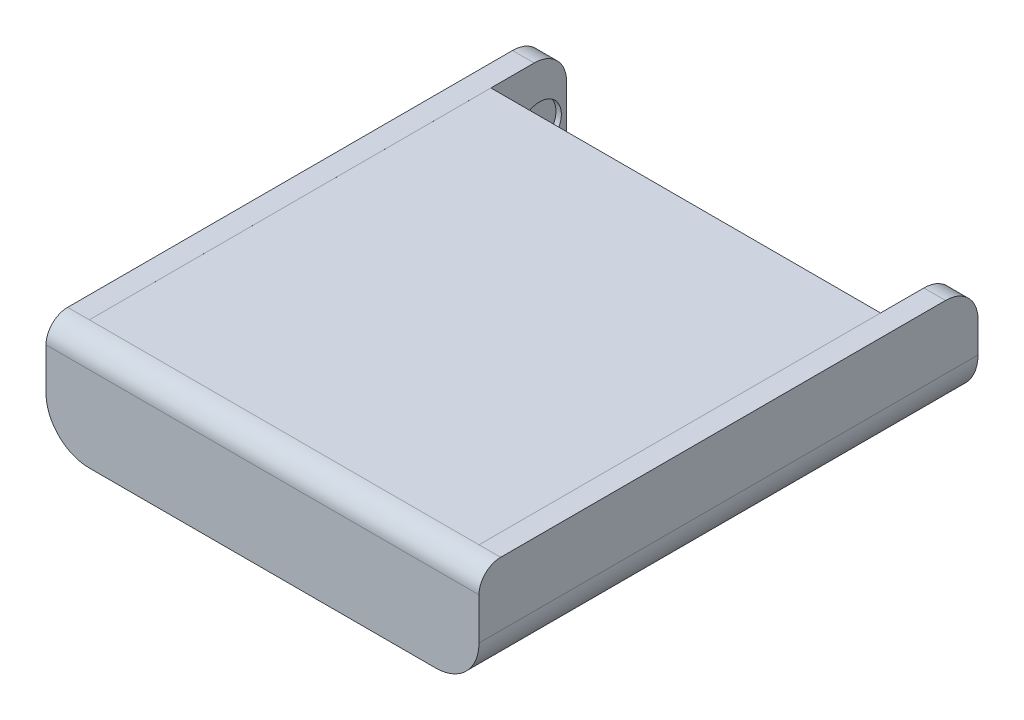
ISO-10303-21;
HEADER;
FILE_DESCRIPTION(('STEP AP214'),'2;1');
FILE_NAME('part.step','',(''),(''),'','','');
FILE_SCHEMA(('AUTOMOTIVE_DESIGN { 1 0 10303 214 1 1 1 1 }'));
ENDSEC;
DATA;
#1=APPLICATION_CONTEXT('core data for automotive mechanical design processes');
#2=APPLICATION_PROTOCOL_DEFINITION('international standard','automotive_design',2000,#1);
#3=PRODUCT_CONTEXT('',#1,'mechanical');
#4=PRODUCT('Part','Part','',(#3));
#5=PRODUCT_RELATED_PRODUCT_CATEGORY('part','',(#4));
#6=PRODUCT_DEFINITION_FORMATION('','',#4);
#7=PRODUCT_DEFINITION_CONTEXT('part definition',#1,'design');
#8=PRODUCT_DEFINITION('design','',#6,#7);
#9=PRODUCT_DEFINITION_SHAPE('','',#8);
#10=(LENGTH_UNIT() NAMED_UNIT(*) SI_UNIT(.MILLI.,.METRE.));
#11=(NAMED_UNIT(*) PLANE_ANGLE_UNIT() SI_UNIT($,.RADIAN.));
#12=(NAMED_UNIT(*) SI_UNIT($,.STERADIAN.) SOLID_ANGLE_UNIT());
#13=UNCERTAINTY_MEASURE_WITH_UNIT(LENGTH_MEASURE(1.E-05),#10,'distance_accuracy_value','');
#14=(GEOMETRIC_REPRESENTATION_CONTEXT(3) GLOBAL_UNCERTAINTY_ASSIGNED_CONTEXT((#13)) GLOBAL_UNIT_ASSIGNED_CONTEXT((#10,
#11,#12)) REPRESENTATION_CONTEXT('',''));
#15=CARTESIAN_POINT('',(0.,0.,0.));
#16=DIRECTION('',(0.,0.,1.));
#17=DIRECTION('',(1.,0.,0.));
#18=AXIS2_PLACEMENT_3D('',#15,#16,#17);
#19=CARTESIAN_POINT('',(139.080001475215,57.170001385808,-2.5));
#20=DIRECTION('',(0.,0.,1.));
#21=DIRECTION('',(1.,0.,0.));
#22=AXIS2_PLACEMENT_3D('',#19,#20,#21);
#23=PLANE('',#22);
#24=DIRECTION('',(1.,0.,0.));
#25=VECTOR('',#24,1.);
#26=CARTESIAN_POINT('',(129.080001475215,58.5303815832172,-2.5));
#27=LINE('',#26,#25);
#28=CARTESIAN_POINT('',(119.080001475215,58.5303815832172,-2.5));
#29=VERTEX_POINT('',#28);
#30=CARTESIAN_POINT('',(159.080001475215,58.5303815832172,-2.5));
#31=VERTEX_POINT('',#30);
#32=EDGE_CURVE('P0_E279',#29,#31,#27,.T.);
#33=ORIENTED_EDGE('',*,*,#32,.F.);
#34=DIRECTION('',(0.,1.,0.));
#35=VECTOR('',#34,1.);
#36=CARTESIAN_POINT('',(119.080001475215,55.920001385808,-2.5));
#37=LINE('',#36,#35);
#38=CARTESIAN_POINT('',(119.080001475215,54.670001385808,-2.5));
#39=VERTEX_POINT('',#38);
#40=EDGE_CURVE('P0_E266',#39,#29,#37,.T.);
#41=ORIENTED_EDGE('',*,*,#40,.F.);
#42=CARTESIAN_POINT('',(123.080001475215,54.670001385808,-2.5));
#43=DIRECTION('',(0.,0.,-1.));
#44=DIRECTION('',(-1.,0.,0.));
#45=AXIS2_PLACEMENT_3D('',#42,#43,#44);
#46=CIRCLE('',#45,4.);
#47=CARTESIAN_POINT('',(123.080001475215,50.670001385808,-2.5));
#48=VERTEX_POINT('',#47);
#49=EDGE_CURVE('P0_E28',#48,#39,#46,.T.);
#50=ORIENTED_EDGE('',*,*,#49,.F.);
#51=DIRECTION('',(-1.,0.,0.));
#52=VECTOR('',#51,1.);
#53=CARTESIAN_POINT('',(147.080001475215,50.670001385808,-2.5));
#54=LINE('',#53,#52);
#55=CARTESIAN_POINT('',(155.080001475215,50.670001385808,-2.5));
#56=VERTEX_POINT('',#55);
#57=EDGE_CURVE('P0_E11',#56,#48,#54,.T.);
#58=ORIENTED_EDGE('',*,*,#57,.F.);
#59=CARTESIAN_POINT('',(155.080001475215,54.670001385808,-2.5));
#60=DIRECTION('',(0.,0.,-1.));
#61=DIRECTION('',(0.,-1.,0.));
#62=AXIS2_PLACEMENT_3D('',#59,#60,#61);
#63=CIRCLE('',#62,4.);
#64=CARTESIAN_POINT('',(159.080001475215,54.670001385808,-2.5));
#65=VERTEX_POINT('',#64);
#66=EDGE_CURVE('P0_E204',#65,#56,#63,.T.);
#67=ORIENTED_EDGE('',*,*,#66,.F.);
#68=DIRECTION('',(0.,-1.,0.));
#69=VECTOR('',#68,1.);
#70=CARTESIAN_POINT('',(159.080001475215,59.1001914845126,-2.5));
#71=LINE('',#70,#69);
#72=EDGE_CURVE('P0_E216',#31,#65,#71,.T.);
#73=ORIENTED_EDGE('',*,*,#72,.F.);
#74=EDGE_LOOP('',(#33,#41,#50,#58,#67,#73));
#75=FACE_BOUND('',#74,.T.);
#76=ADVANCED_FACE('P0_F17',(#75),#23,.T.);
#77=CARTESIAN_POINT('',(139.080001475215,57.170001385808,-48.6));
#78=DIRECTION('',(0.,0.,1.));
#79=DIRECTION('',(1.,0.,0.));
#80=AXIS2_PLACEMENT_3D('',#77,#78,#79);
#81=PLANE('',#80);
#82=DIRECTION('',(-1.,0.,0.));
#83=VECTOR('',#82,1.);
#84=CARTESIAN_POINT('',(129.080001475215,57.5303815832172,-48.6));
#85=LINE('',#84,#83);
#86=CARTESIAN_POINT('',(159.080001475215,57.5303815832172,-48.6));
#87=VERTEX_POINT('',#86);
#88=CARTESIAN_POINT('',(157.080001475215,57.5303815832172,-48.6));
#89=VERTEX_POINT('',#88);
#90=EDGE_CURVE('P0_E283',#87,#89,#85,.T.);
#91=ORIENTED_EDGE('',*,*,#90,.F.);
#92=DIRECTION('',(0.,-1.,0.));
#93=VECTOR('',#92,1.);
#94=CARTESIAN_POINT('',(159.080001475215,61.670001385808,-48.6));
#95=LINE('',#94,#93);
#96=CARTESIAN_POINT('',(159.080001475215,54.670001385808,-48.6));
#97=VERTEX_POINT('',#96);
#98=EDGE_CURVE('P0_E230',#87,#97,#95,.T.);
#99=ORIENTED_EDGE('',*,*,#98,.T.);
#100=CARTESIAN_POINT('',(155.080001475215,54.670001385808,-48.6));
#101=DIRECTION('',(0.,0.,-1.));
#102=DIRECTION('',(0.,-1.,0.));
#103=AXIS2_PLACEMENT_3D('',#100,#101,#102);
#104=CIRCLE('',#103,4.);
#105=CARTESIAN_POINT('',(157.080001475215,51.2058997706702,-48.6));
#106=VERTEX_POINT('',#105);
#107=EDGE_CURVE('P0_E196',#97,#106,#104,.T.);
#108=ORIENTED_EDGE('',*,*,#107,.T.);
#109=DIRECTION('',(0.,1.,0.));
#110=VECTOR('',#109,1.);
#111=CARTESIAN_POINT('',(157.080001475215,55.0908431352626,-48.6));
#112=LINE('',#111,#110);
#113=EDGE_CURVE('P0_E348',#106,#89,#112,.T.);
#114=ORIENTED_EDGE('',*,*,#113,.T.);
#115=EDGE_LOOP('',(#91,#99,#108,#114));
#116=FACE_BOUND('',#115,.T.);
#117=ADVANCED_FACE('P0_F443',(#116),#81,.F.);
#118=CARTESIAN_POINT('',(155.080001475215,50.670001385808,-2.));
#119=DIRECTION('',(0.,-1.,0.));
#120=DIRECTION('',(-1.,0.,0.));
#121=AXIS2_PLACEMENT_3D('',#118,#119,#120);
#122=PLANE('',#121);
#123=CARTESIAN_POINT('',(139.080001475215,50.670001385808,-21.16));
#124=DIRECTION('',(0.,1.,0.));
#125=DIRECTION('',(1.,0.,0.));
#126=AXIS2_PLACEMENT_3D('',#123,#124,#125);
#127=CIRCLE('',#126,4.);
#128=CARTESIAN_POINT('',(135.080001475215,50.670001385808,-21.16));
#129=VERTEX_POINT('',#128);
#130=EDGE_CURVE('P0_E237',#129,#129,#127,.T.);
#131=ORIENTED_EDGE('',*,*,#130,.T.);
#132=EDGE_LOOP('',(#131));
#133=FACE_BOUND('',#132,.T.);
#134=DIRECTION('',(1.,0.,0.));
#135=VECTOR('',#134,1.);
#136=CARTESIAN_POINT('',(147.080001475215,50.670001385808,-41.6));
#137=LINE('',#136,#135);
#138=CARTESIAN_POINT('',(123.080001475215,50.670001385808,-41.6));
#139=VERTEX_POINT('',#138);
#140=CARTESIAN_POINT('',(155.080001475215,50.670001385808,-41.6));
#141=VERTEX_POINT('',#140);
#142=EDGE_CURVE('P0_E308',#139,#141,#137,.T.);
#143=ORIENTED_EDGE('',*,*,#142,.T.);
#144=DIRECTION('',(0.,0.,-1.));
#145=VECTOR('',#144,1.);
#146=CARTESIAN_POINT('',(155.080001475215,50.670001385808,-2.));
#147=LINE('',#146,#145);
#148=EDGE_CURVE('P0_E231',#56,#141,#147,.T.);
#149=ORIENTED_EDGE('',*,*,#148,.F.);
#150=ORIENTED_EDGE('',*,*,#57,.T.);
#151=DIRECTION('',(0.,0.,-1.));
#152=VECTOR('',#151,1.);
#153=CARTESIAN_POINT('',(123.080001475215,50.670001385808,-2.));
#154=LINE('',#153,#152);
#155=EDGE_CURVE('P0_E234',#48,#139,#154,.T.);
#156=ORIENTED_EDGE('',*,*,#155,.T.);
#157=EDGE_LOOP('',(#143,#149,#150,#156));
#158=FACE_BOUND('',#157,.T.);
#159=ADVANCED_FACE('P0_F449',(#133,#158),#122,.T.);
#160=CARTESIAN_POINT('',(123.080001475215,54.670001385808,-2.));
#161=DIRECTION('',(0.,0.,-1.));
#162=DIRECTION('',(-1.,0.,0.));
#163=AXIS2_PLACEMENT_3D('',#160,#161,#162);
#164=CYLINDRICAL_SURFACE('',#163,4.);
#165=CARTESIAN_POINT('',(123.080001475215,54.670001385808,-41.6));
#166=DIRECTION('',(0.,0.,1.));
#167=DIRECTION('',(-1.,0.,0.));
#168=AXIS2_PLACEMENT_3D('',#165,#166,#167);
#169=CIRCLE('',#168,4.);
#170=CARTESIAN_POINT('',(121.080001475215,51.2058997706702,-41.6));
#171=VERTEX_POINT('',#170);
#172=EDGE_CURVE('P0_E312',#171,#139,#169,.T.);
#173=ORIENTED_EDGE('',*,*,#172,.T.);
#174=ORIENTED_EDGE('',*,*,#155,.F.);
#175=ORIENTED_EDGE('',*,*,#49,.T.);
#176=DIRECTION('',(0.,0.,-1.));
#177=VECTOR('',#176,1.);
#178=CARTESIAN_POINT('',(119.080001475215,54.670001385808,-2.));
#179=LINE('',#178,#177);
#180=CARTESIAN_POINT('',(119.080001475215,54.670001385808,-48.6));
#181=VERTEX_POINT('',#180);
#182=EDGE_CURVE('P0_E333',#39,#181,#179,.T.);
#183=ORIENTED_EDGE('',*,*,#182,.T.);
#184=CARTESIAN_POINT('',(123.080001475215,54.670001385808,-48.6));
#185=DIRECTION('',(0.,0.,-1.));
#186=DIRECTION('',(-1.,0.,0.));
#187=AXIS2_PLACEMENT_3D('',#184,#185,#186);
#188=CIRCLE('',#187,4.);
#189=CARTESIAN_POINT('',(121.080001475215,51.2058997706702,-48.6));
#190=VERTEX_POINT('',#189);
#191=EDGE_CURVE('P0_E269',#190,#181,#188,.T.);
#192=ORIENTED_EDGE('',*,*,#191,.F.);
#193=DIRECTION('',(0.,0.,1.));
#194=VECTOR('',#193,1.);
#195=CARTESIAN_POINT('',(121.080001475215,51.2058997706702,-2.));
#196=LINE('',#195,#194);
#197=EDGE_CURVE('P0_E271',#190,#171,#196,.T.);
#198=ORIENTED_EDGE('',*,*,#197,.T.);
#199=EDGE_LOOP('',(#173,#174,#175,#183,#192,#198));
#200=FACE_BOUND('',#199,.T.);
#201=ADVANCED_FACE('P0_F469',(#200),#164,.T.);
#202=CARTESIAN_POINT('',(155.080001475215,54.670001385808,-2.));
#203=DIRECTION('',(0.,0.,-1.));
#204=DIRECTION('',(0.,-1.,0.));
#205=AXIS2_PLACEMENT_3D('',#202,#203,#204);
#206=CYLINDRICAL_SURFACE('',#205,4.);
#207=CARTESIAN_POINT('',(155.080001475215,54.670001385808,-41.6));
#208=DIRECTION('',(0.,0.,1.));
#209=DIRECTION('',(0.,-1.,0.));
#210=AXIS2_PLACEMENT_3D('',#207,#208,#209);
#211=CIRCLE('',#210,4.);
#212=CARTESIAN_POINT('',(157.080001475215,51.2058997706702,-41.6));
#213=VERTEX_POINT('',#212);
#214=EDGE_CURVE('P0_E214',#141,#213,#211,.T.);
#215=ORIENTED_EDGE('',*,*,#214,.T.);
#216=DIRECTION('',(0.,0.,-1.));
#217=VECTOR('',#216,1.);
#218=CARTESIAN_POINT('',(157.080001475215,51.2058997706702,-2.));
#219=LINE('',#218,#217);
#220=EDGE_CURVE('P0_E363',#213,#106,#219,.T.);
#221=ORIENTED_EDGE('',*,*,#220,.T.);
#222=ORIENTED_EDGE('',*,*,#107,.F.);
#223=DIRECTION('',(0.,0.,-1.));
#224=VECTOR('',#223,1.);
#225=CARTESIAN_POINT('',(159.080001475215,54.670001385808,-2.));
#226=LINE('',#225,#224);
#227=EDGE_CURVE('P0_E220',#65,#97,#226,.T.);
#228=ORIENTED_EDGE('',*,*,#227,.F.);
#229=ORIENTED_EDGE('',*,*,#66,.T.);
#230=ORIENTED_EDGE('',*,*,#148,.T.);
#231=EDGE_LOOP('',(#215,#221,#222,#228,#229,#230));
#232=FACE_BOUND('',#231,.T.);
#233=ADVANCED_FACE('P0_F453',(#232),#206,.T.);
#234=CARTESIAN_POINT('',(120.580001475215,55.170001385808,-46.11));
#235=DIRECTION('',(-1.,0.,0.));
#236=DIRECTION('',(0.,0.,1.));
#237=AXIS2_PLACEMENT_3D('',#234,#235,#236);
#238=PLANE('',#237);
#239=CARTESIAN_POINT('',(120.580001475215,55.170001385808,-46.11));
#240=DIRECTION('',(-1.,0.,0.));
#241=DIRECTION('',(0.,0.,1.));
#242=AXIS2_PLACEMENT_3D('',#239,#240,#241);
#243=CIRCLE('',#242,2.);
#244=CARTESIAN_POINT('',(120.580001475215,55.170001385808,-48.11));
#245=VERTEX_POINT('',#244);
#246=EDGE_CURVE('P0_E189',#245,#245,#243,.T.);
#247=ORIENTED_EDGE('',*,*,#246,.F.);
#248=EDGE_LOOP('',(#247));
#249=FACE_BOUND('',#248,.T.);
#250=ADVANCED_FACE('P0_F731',(#249),#238,.F.);
#251=CARTESIAN_POINT('',(122.330001475215,55.170001385808,-46.11));
#252=DIRECTION('',(-1.,0.,0.));
#253=DIRECTION('',(0.,0.,1.));
#254=AXIS2_PLACEMENT_3D('',#251,#252,#253);
#255=CYLINDRICAL_SURFACE('',#254,2.);
#256=CARTESIAN_POINT('',(121.080001475215,55.170001385808,-46.11));
#257=DIRECTION('',(-1.,0.,0.));
#258=DIRECTION('',(0.,0.,1.));
#259=AXIS2_PLACEMENT_3D('',#256,#257,#258);
#260=CIRCLE('',#259,2.);
#261=CARTESIAN_POINT('',(121.080001475215,55.170001385808,-48.11));
#262=VERTEX_POINT('',#261);
#263=EDGE_CURVE('P0_E238',#262,#262,#260,.T.);
#264=ORIENTED_EDGE('',*,*,#263,.F.);
#265=DIRECTION('',(-1.,0.,0.));
#266=VECTOR('',#265,1.);
#267=CARTESIAN_POINT('',(122.330001475215,55.170001385808,-48.11));
#268=LINE('',#267,#266);
#269=EDGE_CURVE('P0_E192',#262,#245,#268,.T.);
#270=ORIENTED_EDGE('',*,*,#269,.T.);
#271=ORIENTED_EDGE('',*,*,#246,.T.);
#272=ORIENTED_EDGE('',*,*,#269,.F.);
#273=EDGE_LOOP('',(#264,#270,#271,#272));
#274=FACE_BOUND('',#273,.T.);
#275=ADVANCED_FACE('P0_F191',(#274),#255,.F.);
#276=CARTESIAN_POINT('',(157.580001475215,55.170001385808,-46.11));
#277=DIRECTION('',(1.,0.,0.));
#278=DIRECTION('',(0.,0.,-1.));
#279=AXIS2_PLACEMENT_3D('',#276,#277,#278);
#280=PLANE('',#279);
#281=CARTESIAN_POINT('',(157.580001475215,55.170001385808,-46.11));
#282=DIRECTION('',(1.,0.,0.));
#283=DIRECTION('',(0.,0.,-1.));
#284=AXIS2_PLACEMENT_3D('',#281,#282,#283);
#285=CIRCLE('',#284,2.);
#286=CARTESIAN_POINT('',(157.580001475215,55.170001385808,-44.11));
#287=VERTEX_POINT('',#286);
#288=EDGE_CURVE('P0_E182',#287,#287,#285,.T.);
#289=ORIENTED_EDGE('',*,*,#288,.F.);
#290=EDGE_LOOP('',(#289));
#291=FACE_BOUND('',#290,.T.);
#292=ADVANCED_FACE('P0_F722',(#291),#280,.F.);
#293=CARTESIAN_POINT('',(155.830001475215,55.170001385808,-46.11));
#294=DIRECTION('',(1.,0.,0.));
#295=DIRECTION('',(0.,0.,-1.));
#296=AXIS2_PLACEMENT_3D('',#293,#294,#295);
#297=CYLINDRICAL_SURFACE('',#296,2.);
#298=CARTESIAN_POINT('',(157.080001475215,55.170001385808,-46.11));
#299=DIRECTION('',(1.,0.,0.));
#300=DIRECTION('',(0.,0.,-1.));
#301=AXIS2_PLACEMENT_3D('',#298,#299,#300);
#302=CIRCLE('',#301,2.);
#303=CARTESIAN_POINT('',(157.080001475215,55.170001385808,-44.11));
#304=VERTEX_POINT('',#303);
#305=EDGE_CURVE('P0_E211',#304,#304,#302,.T.);
#306=ORIENTED_EDGE('',*,*,#305,.F.);
#307=DIRECTION('',(1.,0.,0.));
#308=VECTOR('',#307,1.);
#309=CARTESIAN_POINT('',(155.830001475215,55.170001385808,-44.11));
#310=LINE('',#309,#308);
#311=EDGE_CURVE('P0_E282',#304,#287,#310,.T.);
#312=ORIENTED_EDGE('',*,*,#311,.T.);
#313=ORIENTED_EDGE('',*,*,#288,.T.);
#314=ORIENTED_EDGE('',*,*,#311,.F.);
#315=EDGE_LOOP('',(#306,#312,#313,#314));
#316=FACE_BOUND('',#315,.T.);
#317=ADVANCED_FACE('P0_F717',(#316),#297,.F.);
#318=CARTESIAN_POINT('',(119.080001475215,60.5303815832172,-2.));
#319=DIRECTION('',(0.,1.,0.));
#320=DIRECTION('',(1.,0.,0.));
#321=AXIS2_PLACEMENT_3D('',#318,#319,#320);
#322=PLANE('',#321);
#323=DIRECTION('',(1.,0.,0.));
#324=VECTOR('',#323,1.);
#325=CARTESIAN_POINT('',(129.080001475215,60.5303815832172,-45.6));
#326=LINE('',#325,#324);
#327=CARTESIAN_POINT('',(119.080001475215,60.5303815832172,-45.6));
#328=VERTEX_POINT('',#327);
#329=CARTESIAN_POINT('',(121.080001475215,60.5303815832172,-45.6));
#330=VERTEX_POINT('',#329);
#331=EDGE_CURVE('P0_E334',#328,#330,#326,.T.);
#332=ORIENTED_EDGE('',*,*,#331,.F.);
#333=DIRECTION('',(0.,0.,-1.));
#334=VECTOR('',#333,1.);
#335=CARTESIAN_POINT('',(119.080001475215,60.5303815832172,-2.));
#336=LINE('',#335,#334);
#337=CARTESIAN_POINT('',(119.080001475215,60.5303815832172,-4.5));
#338=VERTEX_POINT('',#337);
#339=EDGE_CURVE('P0_E265',#338,#328,#336,.T.);
#340=ORIENTED_EDGE('',*,*,#339,.F.);
#341=DIRECTION('',(-1.,0.,0.));
#342=VECTOR('',#341,1.);
#343=CARTESIAN_POINT('',(129.080001475215,60.5303815832172,-4.5));
#344=LINE('',#343,#342);
#345=CARTESIAN_POINT('',(121.080001475215,60.5303815832172,-4.5));
#346=VERTEX_POINT('',#345);
#347=EDGE_CURVE('P0_E164',#346,#338,#344,.T.);
#348=ORIENTED_EDGE('',*,*,#347,.F.);
#349=DIRECTION('',(0.,0.,-1.));
#350=VECTOR('',#349,1.);
#351=CARTESIAN_POINT('',(121.080001475215,60.5303815832172,-2.));
#352=LINE('',#351,#350);
#353=EDGE_CURVE('P0_E249',#346,#330,#352,.T.);
#354=ORIENTED_EDGE('',*,*,#353,.T.);
#355=EDGE_LOOP('',(#332,#340,#348,#354));
#356=FACE_BOUND('',#355,.T.);
#357=ADVANCED_FACE('P0_F19',(#356),#322,.T.);
#358=CARTESIAN_POINT('',(129.080001475215,58.5303815832172,-4.5));
#359=DIRECTION('',(1.,0.,0.));
#360=DIRECTION('',(0.,0.707106781186546,0.707106781186549));
#361=AXIS2_PLACEMENT_3D('',#358,#359,#360);
#362=CYLINDRICAL_SURFACE('',#361,2.);
#363=CARTESIAN_POINT('',(159.080001475215,58.5303815832172,-4.5));
#364=DIRECTION('',(-1.,0.,0.));
#365=DIRECTION('',(0.,0.707106781186546,0.707106781186549));
#366=AXIS2_PLACEMENT_3D('',#363,#364,#365);
#367=CIRCLE('',#366,2.);
#368=CARTESIAN_POINT('',(159.080001475215,60.5303815832172,-4.5));
#369=VERTEX_POINT('',#368);
#370=EDGE_CURVE('P0_E221',#31,#369,#367,.T.);
#371=ORIENTED_EDGE('',*,*,#370,.T.);
#372=DIRECTION('',(-1.,0.,0.));
#373=VECTOR('',#372,1.);
#374=CARTESIAN_POINT('',(129.080001475215,60.5303815832172,-4.5));
#375=LINE('',#374,#373);
#376=CARTESIAN_POINT('',(157.080001475215,60.5303815832172,-4.5));
#377=VERTEX_POINT('',#376);
#378=EDGE_CURVE('P0_E296',#369,#377,#375,.T.);
#379=ORIENTED_EDGE('',*,*,#378,.T.);
#380=DIRECTION('',(-1.,0.,0.));
#381=VECTOR('',#380,1.);
#382=CARTESIAN_POINT('',(129.080001475215,60.5303815832172,-4.5));
#383=LINE('',#382,#381);
#384=EDGE_CURVE('P0_E240',#377,#346,#383,.T.);
#385=ORIENTED_EDGE('',*,*,#384,.T.);
#386=ORIENTED_EDGE('',*,*,#347,.T.);
#387=CARTESIAN_POINT('',(119.080001475215,58.5303815832172,-4.5));
#388=DIRECTION('',(1.,0.,0.));
#389=DIRECTION('',(0.,0.707106781186546,0.707106781186549));
#390=AXIS2_PLACEMENT_3D('',#387,#388,#389);
#391=CIRCLE('',#390,2.);
#392=EDGE_CURVE('P0_E262',#338,#29,#391,.T.);
#393=ORIENTED_EDGE('',*,*,#392,.T.);
#394=ORIENTED_EDGE('',*,*,#32,.T.);
#395=EDGE_LOOP('',(#371,#379,#385,#386,#393,#394));
#396=FACE_BOUND('',#395,.T.);
#397=ADVANCED_FACE('P0_F418',(#396),#362,.T.);
#398=CARTESIAN_POINT('',(119.080001475215,60.5303815832172,-2.));
#399=DIRECTION('',(0.,1.,0.));
#400=DIRECTION('',(1.,0.,0.));
#401=AXIS2_PLACEMENT_3D('',#398,#399,#400);
#402=PLANE('',#401);
#403=DIRECTION('',(1.,0.,0.));
#404=VECTOR('',#403,1.);
#405=CARTESIAN_POINT('',(129.080001475215,60.5303815832172,-45.6));
#406=LINE('',#405,#404);
#407=CARTESIAN_POINT('',(157.080001475215,60.5303815832172,-45.6));
#408=VERTEX_POINT('',#407);
#409=CARTESIAN_POINT('',(159.080001475215,60.5303815832172,-45.6));
#410=VERTEX_POINT('',#409);
#411=EDGE_CURVE('P0_E286',#408,#410,#406,.T.);
#412=ORIENTED_EDGE('',*,*,#411,.F.);
#413=DIRECTION('',(0.,0.,1.));
#414=VECTOR('',#413,1.);
#415=CARTESIAN_POINT('',(157.080001475215,60.5303815832172,-2.));
#416=LINE('',#415,#414);
#417=EDGE_CURVE('P0_E318',#408,#377,#416,.T.);
#418=ORIENTED_EDGE('',*,*,#417,.T.);
#419=ORIENTED_EDGE('',*,*,#378,.F.);
#420=DIRECTION('',(0.,0.,-1.));
#421=VECTOR('',#420,1.);
#422=CARTESIAN_POINT('',(159.080001475215,60.5303815832172,-2.));
#423=LINE('',#422,#421);
#424=EDGE_CURVE('P0_E153',#369,#410,#423,.T.);
#425=ORIENTED_EDGE('',*,*,#424,.T.);
#426=EDGE_LOOP('',(#412,#418,#419,#425));
#427=FACE_BOUND('',#426,.T.);
#428=ADVANCED_FACE('P0_F421',(#427),#402,.T.);
#429=CARTESIAN_POINT('',(159.080001475215,61.0303815832172,-2.));
#430=DIRECTION('',(1.,0.,0.));
#431=DIRECTION('',(0.,1.,0.));
#432=AXIS2_PLACEMENT_3D('',#429,#430,#431);
#433=PLANE('',#432);
#434=CARTESIAN_POINT('',(159.080001475215,57.5303815832172,-45.6));
#435=DIRECTION('',(-1.,0.,0.));
#436=DIRECTION('',(0.,0.707106781186548,-0.707106781186548));
#437=AXIS2_PLACEMENT_3D('',#434,#435,#436);
#438=CIRCLE('',#437,3.);
#439=EDGE_CURVE('P0_E287',#410,#87,#438,.T.);
#440=ORIENTED_EDGE('',*,*,#439,.F.);
#441=ORIENTED_EDGE('',*,*,#424,.F.);
#442=ORIENTED_EDGE('',*,*,#370,.F.);
#443=ORIENTED_EDGE('',*,*,#72,.T.);
#444=ORIENTED_EDGE('',*,*,#227,.T.);
#445=ORIENTED_EDGE('',*,*,#98,.F.);
#446=EDGE_LOOP('',(#440,#441,#442,#443,#444,#445));
#447=FACE_BOUND('',#446,.T.);
#448=ADVANCED_FACE('P0_F644',(#447),#433,.T.);
#449=CARTESIAN_POINT('',(129.080001475215,57.5303815832172,-45.6));
#450=DIRECTION('',(1.,0.,0.));
#451=DIRECTION('',(0.,0.707106781186548,-0.707106781186548));
#452=AXIS2_PLACEMENT_3D('',#449,#450,#451);
#453=CYLINDRICAL_SURFACE('',#452,3.);
#454=ORIENTED_EDGE('',*,*,#439,.T.);
#455=ORIENTED_EDGE('',*,*,#90,.T.);
#456=CARTESIAN_POINT('',(157.080001475215,57.5303815832172,-45.6));
#457=DIRECTION('',(1.,0.,0.));
#458=DIRECTION('',(0.,0.707106781186548,-0.707106781186548));
#459=AXIS2_PLACEMENT_3D('',#456,#457,#458);
#460=CIRCLE('',#459,3.);
#461=EDGE_CURVE('P0_E322',#89,#408,#460,.T.);
#462=ORIENTED_EDGE('',*,*,#461,.T.);
#463=ORIENTED_EDGE('',*,*,#411,.T.);
#464=EDGE_LOOP('',(#454,#455,#462,#463));
#465=FACE_BOUND('',#464,.T.);
#466=ADVANCED_FACE('P0_F639',(#465),#453,.T.);
#467=CARTESIAN_POINT('',(139.080001475215,57.170001385808,-48.6));
#468=DIRECTION('',(0.,0.,1.));
#469=DIRECTION('',(1.,0.,0.));
#470=AXIS2_PLACEMENT_3D('',#467,#468,#469);
#471=PLANE('',#470);
#472=DIRECTION('',(-1.,0.,0.));
#473=VECTOR('',#472,1.);
#474=CARTESIAN_POINT('',(129.080001475215,57.5303815832172,-48.6));
#475=LINE('',#474,#473);
#476=CARTESIAN_POINT('',(121.080001475215,57.5303815832172,-48.6));
#477=VERTEX_POINT('',#476);
#478=CARTESIAN_POINT('',(119.080001475215,57.5303815832172,-48.6));
#479=VERTEX_POINT('',#478);
#480=EDGE_CURVE('P0_E208',#477,#479,#475,.T.);
#481=ORIENTED_EDGE('',*,*,#480,.F.);
#482=DIRECTION('',(0.,-1.,0.));
#483=VECTOR('',#482,1.);
#484=CARTESIAN_POINT('',(121.080001475215,55.920001385808,-48.6));
#485=LINE('',#484,#483);
#486=EDGE_CURVE('P0_E275',#477,#190,#485,.T.);
#487=ORIENTED_EDGE('',*,*,#486,.T.);
#488=ORIENTED_EDGE('',*,*,#191,.T.);
#489=DIRECTION('',(0.,1.,0.));
#490=VECTOR('',#489,1.);
#491=CARTESIAN_POINT('',(119.080001475215,54.670001385808,-48.6));
#492=LINE('',#491,#490);
#493=EDGE_CURVE('P0_E330',#181,#479,#492,.T.);
#494=ORIENTED_EDGE('',*,*,#493,.T.);
#495=EDGE_LOOP('',(#481,#487,#488,#494));
#496=FACE_BOUND('',#495,.T.);
#497=ADVANCED_FACE('P0_F394',(#496),#471,.F.);
#498=CARTESIAN_POINT('',(119.080001475215,54.670001385808,-2.));
#499=DIRECTION('',(-1.,0.,0.));
#500=DIRECTION('',(0.,0.,1.));
#501=AXIS2_PLACEMENT_3D('',#498,#499,#500);
#502=PLANE('',#501);
#503=CARTESIAN_POINT('',(119.080001475215,57.5303815832172,-45.6));
#504=DIRECTION('',(1.,0.,0.));
#505=DIRECTION('',(0.,0.707106781186548,-0.707106781186548));
#506=AXIS2_PLACEMENT_3D('',#503,#504,#505);
#507=CIRCLE('',#506,3.);
#508=EDGE_CURVE('P0_E352',#479,#328,#507,.T.);
#509=ORIENTED_EDGE('',*,*,#508,.F.);
#510=ORIENTED_EDGE('',*,*,#493,.F.);
#511=ORIENTED_EDGE('',*,*,#182,.F.);
#512=ORIENTED_EDGE('',*,*,#40,.T.);
#513=ORIENTED_EDGE('',*,*,#392,.F.);
#514=ORIENTED_EDGE('',*,*,#339,.T.);
#515=EDGE_LOOP('',(#509,#510,#511,#512,#513,#514));
#516=FACE_BOUND('',#515,.T.);
#517=ADVANCED_FACE('P0_F400',(#516),#502,.T.);
#518=CARTESIAN_POINT('',(129.080001475215,57.5303815832172,-45.6));
#519=DIRECTION('',(1.,0.,0.));
#520=DIRECTION('',(0.,0.707106781186548,-0.707106781186548));
#521=AXIS2_PLACEMENT_3D('',#518,#519,#520);
#522=CYLINDRICAL_SURFACE('',#521,3.);
#523=CARTESIAN_POINT('',(121.080001475215,57.5303815832172,-45.6));
#524=DIRECTION('',(-1.,0.,0.));
#525=DIRECTION('',(0.,0.707106781186548,-0.707106781186548));
#526=AXIS2_PLACEMENT_3D('',#523,#524,#525);
#527=CIRCLE('',#526,3.);
#528=EDGE_CURVE('P0_E257',#330,#477,#527,.T.);
#529=ORIENTED_EDGE('',*,*,#528,.T.);
#530=ORIENTED_EDGE('',*,*,#480,.T.);
#531=ORIENTED_EDGE('',*,*,#508,.T.);
#532=ORIENTED_EDGE('',*,*,#331,.T.);
#533=EDGE_LOOP('',(#529,#530,#531,#532));
#534=FACE_BOUND('',#533,.T.);
#535=ADVANCED_FACE('P0_F390',(#534),#522,.T.);
#536=CARTESIAN_POINT('',(139.080001475215,50.670001385808,-21.16));
#537=DIRECTION('',(0.,1.,0.));
#538=DIRECTION('',(1.,0.,0.));
#539=AXIS2_PLACEMENT_3D('',#536,#537,#538);
#540=CYLINDRICAL_SURFACE('',#539,4.);
#541=ORIENTED_EDGE('',*,*,#130,.F.);
#542=DIRECTION('',(0.,1.,0.));
#543=VECTOR('',#542,1.);
#544=CARTESIAN_POINT('',(135.080001475215,50.670001385808,-21.16));
#545=LINE('',#544,#543);
#546=CARTESIAN_POINT('',(135.080001475215,52.670001385808,-21.16));
#547=VERTEX_POINT('',#546);
#548=EDGE_CURVE('P0_E235',#129,#547,#545,.T.);
#549=ORIENTED_EDGE('',*,*,#548,.T.);
#550=CARTESIAN_POINT('',(139.080001475215,52.670001385808,-21.16));
#551=DIRECTION('',(0.,-1.,0.));
#552=DIRECTION('',(1.,0.,0.));
#553=AXIS2_PLACEMENT_3D('',#550,#551,#552);
#554=CIRCLE('',#553,4.);
#555=EDGE_CURVE('P0_E226',#547,#547,#554,.T.);
#556=ORIENTED_EDGE('',*,*,#555,.F.);
#557=ORIENTED_EDGE('',*,*,#548,.F.);
#558=EDGE_LOOP('',(#541,#549,#556,#557));
#559=FACE_BOUND('',#558,.T.);
#560=ADVANCED_FACE('P0_F455',(#559),#540,.F.);
#561=CARTESIAN_POINT('',(139.080001475215,53.0116848847172,-41.6));
#562=DIRECTION('',(0.,0.,-1.));
#563=DIRECTION('',(0.,-1.,0.));
#564=AXIS2_PLACEMENT_3D('',#561,#562,#563);
#565=PLANE('',#564);
#566=DIRECTION('',(0.,1.,0.));
#567=VECTOR('',#566,1.);
#568=CARTESIAN_POINT('',(157.080001475215,53.0116848847172,-41.6));
#569=LINE('',#568,#567);
#570=CARTESIAN_POINT('',(157.080001475215,60.530001385808,-41.6));
#571=VERTEX_POINT('',#570);
#572=EDGE_CURVE('P0_E77',#213,#571,#569,.T.);
#573=ORIENTED_EDGE('',*,*,#572,.F.);
#574=ORIENTED_EDGE('',*,*,#214,.F.);
#575=ORIENTED_EDGE('',*,*,#142,.F.);
#576=ORIENTED_EDGE('',*,*,#172,.F.);
#577=DIRECTION('',(0.,1.,0.));
#578=VECTOR('',#577,1.);
#579=CARTESIAN_POINT('',(121.080001475215,53.0116848847172,-41.6));
#580=LINE('',#579,#578);
#581=CARTESIAN_POINT('',(121.080001475215,60.530001385808,-41.6));
#582=VERTEX_POINT('',#581);
#583=EDGE_CURVE('P0_E21',#171,#582,#580,.T.);
#584=ORIENTED_EDGE('',*,*,#583,.T.);
#585=DIRECTION('',(-1.,0.,0.));
#586=VECTOR('',#585,1.);
#587=CARTESIAN_POINT('',(147.080001475215,60.530001385808,-41.6));
#588=LINE('',#587,#586);
#589=EDGE_CURVE('P0_E225',#571,#582,#588,.T.);
#590=ORIENTED_EDGE('',*,*,#589,.F.);
#591=EDGE_LOOP('',(#573,#574,#575,#576,#584,#590));
#592=FACE_BOUND('',#591,.T.);
#593=ADVANCED_FACE('P0_F437',(#592),#565,.T.);
#594=CARTESIAN_POINT('',(157.080001475215,61.0303815832172,-2.));
#595=DIRECTION('',(1.,0.,0.));
#596=DIRECTION('',(0.,1.,0.));
#597=AXIS2_PLACEMENT_3D('',#594,#595,#596);
#598=PLANE('',#597);
#599=ORIENTED_EDGE('',*,*,#305,.T.);
#600=EDGE_LOOP('',(#599));
#601=FACE_BOUND('',#600,.T.);
#602=DIRECTION('',(0.,0.,1.));
#603=VECTOR('',#602,1.);
#604=CARTESIAN_POINT('',(157.080001475215,60.530001385808,-2.));
#605=LINE('',#604,#603);
#606=CARTESIAN_POINT('',(157.080001475215,60.530001385808,-4.5));
#607=VERTEX_POINT('',#606);
#608=EDGE_CURVE('P0_E222',#571,#607,#605,.T.);
#609=ORIENTED_EDGE('',*,*,#608,.T.);
#610=DIRECTION('',(0.,-1.,0.));
#611=VECTOR('',#610,1.);
#612=CARTESIAN_POINT('',(157.080001475215,59.1001914845126,-4.5));
#613=LINE('',#612,#611);
#614=EDGE_CURVE('P0_E90',#377,#607,#613,.T.);
#615=ORIENTED_EDGE('',*,*,#614,.F.);
#616=ORIENTED_EDGE('',*,*,#417,.F.);
#617=ORIENTED_EDGE('',*,*,#461,.F.);
#618=ORIENTED_EDGE('',*,*,#113,.F.);
#619=ORIENTED_EDGE('',*,*,#220,.F.);
#620=ORIENTED_EDGE('',*,*,#572,.T.);
#621=EDGE_LOOP('',(#609,#615,#616,#617,#618,#619,#620));
#622=FACE_BOUND('',#621,.T.);
#623=ADVANCED_FACE('P0_F423',(#601,#622),#598,.F.);
#624=CARTESIAN_POINT('',(139.080001475215,57.170001385808,-4.5));
#625=DIRECTION('',(0.,0.,1.));
#626=DIRECTION('',(1.,0.,0.));
#627=AXIS2_PLACEMENT_3D('',#624,#625,#626);
#628=PLANE('',#627);
#629=DIRECTION('',(-1.,0.,0.));
#630=VECTOR('',#629,1.);
#631=CARTESIAN_POINT('',(147.080001475215,60.530001385808,-4.5));
#632=LINE('',#631,#630);
#633=CARTESIAN_POINT('',(121.080001475215,60.530001385808,-4.5));
#634=VERTEX_POINT('',#633);
#635=EDGE_CURVE('P0_E292',#607,#634,#632,.T.);
#636=ORIENTED_EDGE('',*,*,#635,.T.);
#637=DIRECTION('',(0.,1.,0.));
#638=VECTOR('',#637,1.);
#639=CARTESIAN_POINT('',(121.080001475215,55.920001385808,-4.5));
#640=LINE('',#639,#638);
#641=EDGE_CURVE('P0_E241',#634,#346,#640,.T.);
#642=ORIENTED_EDGE('',*,*,#641,.T.);
#643=ORIENTED_EDGE('',*,*,#384,.F.);
#644=ORIENTED_EDGE('',*,*,#614,.T.);
#645=EDGE_LOOP('',(#636,#642,#643,#644));
#646=FACE_BOUND('',#645,.T.);
#647=ADVANCED_FACE('P0_F425',(#646),#628,.F.);
#648=CARTESIAN_POINT('',(121.080001475215,54.670001385808,-2.));
#649=DIRECTION('',(-1.,0.,0.));
#650=DIRECTION('',(0.,0.,1.));
#651=AXIS2_PLACEMENT_3D('',#648,#649,#650);
#652=PLANE('',#651);
#653=ORIENTED_EDGE('',*,*,#263,.T.);
#654=EDGE_LOOP('',(#653));
#655=FACE_BOUND('',#654,.T.);
#656=DIRECTION('',(0.,0.,-1.));
#657=VECTOR('',#656,1.);
#658=CARTESIAN_POINT('',(121.080001475215,60.530001385808,-2.));
#659=LINE('',#658,#657);
#660=EDGE_CURVE('P0_E288',#634,#582,#659,.T.);
#661=ORIENTED_EDGE('',*,*,#660,.T.);
#662=ORIENTED_EDGE('',*,*,#583,.F.);
#663=ORIENTED_EDGE('',*,*,#197,.F.);
#664=ORIENTED_EDGE('',*,*,#486,.F.);
#665=ORIENTED_EDGE('',*,*,#528,.F.);
#666=ORIENTED_EDGE('',*,*,#353,.F.);
#667=ORIENTED_EDGE('',*,*,#641,.F.);
#668=EDGE_LOOP('',(#661,#662,#663,#664,#665,#666,#667));
#669=FACE_BOUND('',#668,.T.);
#670=ADVANCED_FACE('P0_F428',(#655,#669),#652,.F.);
#671=CARTESIAN_POINT('',(155.080001475215,60.530001385808,-2.));
#672=DIRECTION('',(0.,-1.,0.));
#673=DIRECTION('',(-1.,0.,0.));
#674=AXIS2_PLACEMENT_3D('',#671,#672,#673);
#675=PLANE('',#674);
#676=ORIENTED_EDGE('',*,*,#608,.F.);
#677=ORIENTED_EDGE('',*,*,#589,.T.);
#678=ORIENTED_EDGE('',*,*,#660,.F.);
#679=ORIENTED_EDGE('',*,*,#635,.F.);
#680=EDGE_LOOP('',(#676,#677,#678,#679));
#681=FACE_BOUND('',#680,.T.);
#682=ADVANCED_FACE('P0_F435',(#681),#675,.F.);
#683=CARTESIAN_POINT('',(155.080001475215,52.670001385808,-2.));
#684=DIRECTION('',(0.,-1.,0.));
#685=DIRECTION('',(-1.,0.,0.));
#686=AXIS2_PLACEMENT_3D('',#683,#684,#685);
#687=PLANE('',#686);
#688=ORIENTED_EDGE('',*,*,#555,.T.);
#689=EDGE_LOOP('',(#688));
#690=FACE_BOUND('',#689,.T.);
#691=ADVANCED_FACE('P0_F687',(#690),#687,.T.);
#692=CLOSED_SHELL('',(#76,#117,#159,#201,#233,#250,#275,#292,#317,#357,#397,#428,#448,#466,#497,
#517,#535,#560,#593,#623,#647,#670,#682,#691));
#693=MANIFOLD_SOLID_BREP('P0_B1',#692);
#694=CARTESIAN_POINT('',(139.080001475215,52.670001385808,-21.16));
#695=DIRECTION('',(0.,-1.,0.));
#696=DIRECTION('',(-1.,0.,0.));
#697=AXIS2_PLACEMENT_3D('',#694,#695,#696);
#698=PLANE('',#697);
#699=CARTESIAN_POINT('',(139.080001475215,52.670001385808,-21.16));
#700=DIRECTION('',(0.,-1.,0.));
#701=DIRECTION('',(0.,0.,-1.));
#702=AXIS2_PLACEMENT_3D('',#699,#700,#701);
#703=CIRCLE('',#702,2.55905);
#704=CARTESIAN_POINT('',(139.080001475215,52.670001385808,-18.60095));
#705=VERTEX_POINT('',#704);
#706=EDGE_CURVE('P1_E64',#705,#705,#703,.T.);
#707=ORIENTED_EDGE('',*,*,#706,.T.);
#708=EDGE_LOOP('',(#707));
#709=FACE_BOUND('',#708,.T.);
#710=CARTESIAN_POINT('',(139.080001475215,52.670001385808,-21.16));
#711=DIRECTION('',(0.,1.,0.));
#712=DIRECTION('',(1.,0.,0.));
#713=AXIS2_PLACEMENT_3D('',#710,#711,#712);
#714=CIRCLE('',#713,4.);
#715=CARTESIAN_POINT('',(135.080001475215,52.670001385808,-21.16));
#716=VERTEX_POINT('',#715);
#717=EDGE_CURVE('P1_E81',#716,#716,#714,.T.);
#718=ORIENTED_EDGE('',*,*,#717,.T.);
#719=EDGE_LOOP('',(#718));
#720=FACE_BOUND('',#719,.T.);
#721=ADVANCED_FACE('P1_F17',(#709,#720),#698,.F.);
#722=CARTESIAN_POINT('',(139.080001475215,50.670001385808,-21.16));
#723=DIRECTION('',(0.,-1.,0.));
#724=DIRECTION('',(-1.,0.,0.));
#725=AXIS2_PLACEMENT_3D('',#722,#723,#724);
#726=PLANE('',#725);
#727=CARTESIAN_POINT('',(139.080001475215,50.670001385808,-21.16));
#728=DIRECTION('',(0.,1.,0.));
#729=DIRECTION('',(0.,0.,-1.));
#730=AXIS2_PLACEMENT_3D('',#727,#728,#729);
#731=CIRCLE('',#730,2.815);
#732=CARTESIAN_POINT('',(139.080001475215,50.670001385808,-18.345));
#733=VERTEX_POINT('',#732);
#734=EDGE_CURVE('P1_E21',#733,#733,#731,.T.);
#735=ORIENTED_EDGE('',*,*,#734,.T.);
#736=EDGE_LOOP('',(#735));
#737=FACE_BOUND('',#736,.T.);
#738=CARTESIAN_POINT('',(139.080001475215,50.670001385808,-21.16));
#739=DIRECTION('',(0.,-1.,0.));
#740=DIRECTION('',(1.,0.,0.));
#741=AXIS2_PLACEMENT_3D('',#738,#739,#740);
#742=CIRCLE('',#741,4.);
#743=CARTESIAN_POINT('',(135.080001475215,50.670001385808,-21.16));
#744=VERTEX_POINT('',#743);
#745=EDGE_CURVE('P1_E11',#744,#744,#742,.T.);
#746=ORIENTED_EDGE('',*,*,#745,.T.);
#747=EDGE_LOOP('',(#746));
#748=FACE_BOUND('',#747,.T.);
#749=ADVANCED_FACE('P1_F91',(#737,#748),#726,.T.);
#750=CARTESIAN_POINT('',(139.080001475215,50.670001385808,-21.16));
#751=DIRECTION('',(0.,1.,0.));
#752=DIRECTION('',(1.,0.,0.));
#753=AXIS2_PLACEMENT_3D('',#750,#751,#752);
#754=CYLINDRICAL_SURFACE('',#753,4.);
#755=ORIENTED_EDGE('',*,*,#717,.F.);
#756=DIRECTION('',(0.,-1.,0.));
#757=VECTOR('',#756,1.);
#758=CARTESIAN_POINT('',(135.080001475215,50.670001385808,-21.16));
#759=LINE('',#758,#757);
#760=EDGE_CURVE('P1_E27',#716,#744,#759,.T.);
#761=ORIENTED_EDGE('',*,*,#760,.T.);
#762=ORIENTED_EDGE('',*,*,#745,.F.);
#763=ORIENTED_EDGE('',*,*,#760,.F.);
#764=EDGE_LOOP('',(#755,#761,#762,#763));
#765=FACE_BOUND('',#764,.T.);
#766=ADVANCED_FACE('P1_F93',(#765),#754,.T.);
#767=CARTESIAN_POINT('',(139.080001475215,51.670001385808,-21.16));
#768=DIRECTION('',(0.,1.,0.));
#769=DIRECTION('',(0.,0.,-1.));
#770=AXIS2_PLACEMENT_3D('',#767,#768,#769);
#771=CYLINDRICAL_SURFACE('',#770,2.55905);
#772=CARTESIAN_POINT('',(139.080001475215,50.925951385808,-21.16));
#773=DIRECTION('',(0.,1.,0.));
#774=DIRECTION('',(0.,0.,-1.));
#775=AXIS2_PLACEMENT_3D('',#772,#773,#774);
#776=CIRCLE('',#775,2.55905);
#777=CARTESIAN_POINT('',(139.080001475215,50.925951385808,-18.60095));
#778=VERTEX_POINT('',#777);
#779=EDGE_CURVE('P1_E62',#778,#778,#776,.T.);
#780=ORIENTED_EDGE('',*,*,#779,.F.);
#781=DIRECTION('',(0.,1.,0.));
#782=VECTOR('',#781,1.);
#783=CARTESIAN_POINT('',(139.080001475215,51.670001385808,-18.60095));
#784=LINE('',#783,#782);
#785=EDGE_CURVE('P1_E60',#778,#705,#784,.T.);
#786=ORIENTED_EDGE('',*,*,#785,.T.);
#787=ORIENTED_EDGE('',*,*,#706,.F.);
#788=ORIENTED_EDGE('',*,*,#785,.F.);
#789=EDGE_LOOP('',(#780,#786,#787,#788));
#790=FACE_BOUND('',#789,.T.);
#791=ADVANCED_FACE('P1_F19',(#790),#771,.F.);
#792=CARTESIAN_POINT('',(139.080001475215,50.798001385808,-21.16));
#793=DIRECTION('',(0.,-1.,0.));
#794=DIRECTION('',(0.,0.,-1.));
#795=AXIS2_PLACEMENT_3D('',#792,#793,#794);
#796=CONICAL_SURFACE('',#795,2.687,0.785398163397448);
#797=ORIENTED_EDGE('',*,*,#734,.F.);
#798=DIRECTION('',(0.,0.707106781186548,-0.707106781186547));
#799=VECTOR('',#798,1.);
#800=CARTESIAN_POINT('',(139.080001475215,50.798001385808,-18.473));
#801=LINE('',#800,#799);
#802=EDGE_CURVE('P1_E70',#733,#778,#801,.T.);
#803=ORIENTED_EDGE('',*,*,#802,.T.);
#804=ORIENTED_EDGE('',*,*,#779,.T.);
#805=ORIENTED_EDGE('',*,*,#802,.F.);
#806=EDGE_LOOP('',(#797,#803,#804,#805));
#807=FACE_BOUND('',#806,.T.);
#808=ADVANCED_FACE('P1_F69',(#807),#796,.F.);
#809=CLOSED_SHELL('',(#721,#749,#766,#791,#808));
#810=MANIFOLD_SOLID_BREP('P1_B1',#809);
#811=ADVANCED_BREP_SHAPE_REPRESENTATION('',(#18,#693,#810),#14);
#812=SHAPE_DEFINITION_REPRESENTATION(#9,#811);
ENDSEC;
END-ISO-10303-21;
